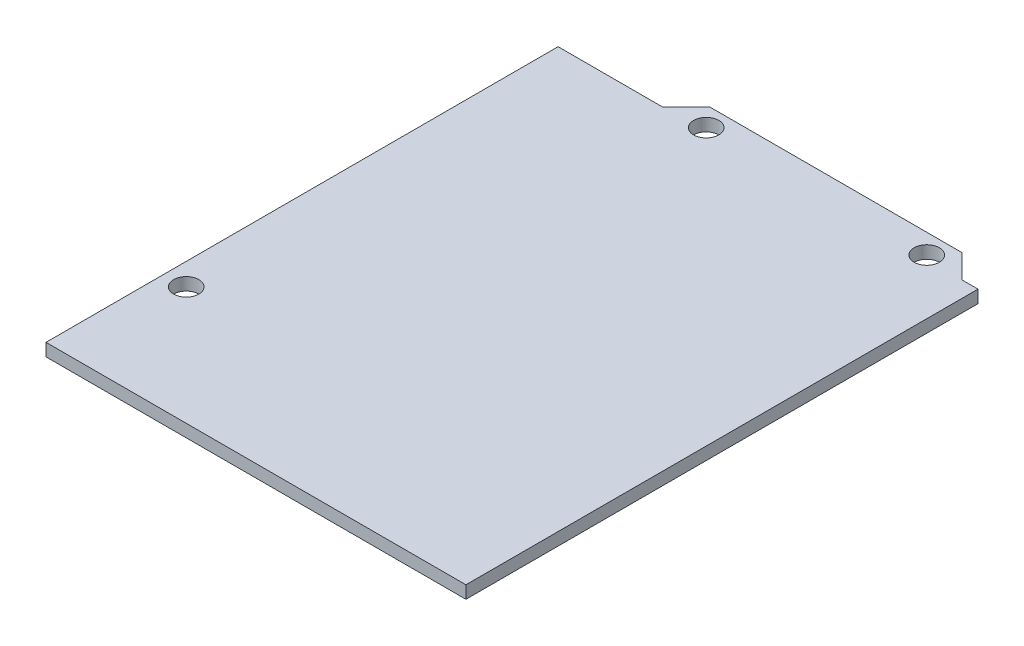
ISO-10303-21;
HEADER;
FILE_DESCRIPTION(('STEP AP214'),'2;1');
FILE_NAME('part.step','',(''),(''),'','','');
FILE_SCHEMA(('AUTOMOTIVE_DESIGN { 1 0 10303 214 1 1 1 1 }'));
ENDSEC;
DATA;
#1=APPLICATION_CONTEXT('core data for automotive mechanical design processes');
#2=APPLICATION_PROTOCOL_DEFINITION('international standard','automotive_design',2000,#1);
#3=PRODUCT_CONTEXT('',#1,'mechanical');
#4=PRODUCT('Part','Part','',(#3));
#5=PRODUCT_RELATED_PRODUCT_CATEGORY('part','',(#4));
#6=PRODUCT_DEFINITION_FORMATION('','',#4);
#7=PRODUCT_DEFINITION_CONTEXT('part definition',#1,'design');
#8=PRODUCT_DEFINITION('design','',#6,#7);
#9=PRODUCT_DEFINITION_SHAPE('','',#8);
#10=(LENGTH_UNIT() NAMED_UNIT(*) SI_UNIT(.MILLI.,.METRE.));
#11=(NAMED_UNIT(*) PLANE_ANGLE_UNIT() SI_UNIT($,.RADIAN.));
#12=(NAMED_UNIT(*) SI_UNIT($,.STERADIAN.) SOLID_ANGLE_UNIT());
#13=UNCERTAINTY_MEASURE_WITH_UNIT(LENGTH_MEASURE(1.E-05),#10,'distance_accuracy_value','');
#14=(GEOMETRIC_REPRESENTATION_CONTEXT(3) GLOBAL_UNCERTAINTY_ASSIGNED_CONTEXT((#13)) GLOBAL_UNIT_ASSIGNED_CONTEXT((#10,
#11,#12)) REPRESENTATION_CONTEXT('',''));
#15=CARTESIAN_POINT('',(0.,0.,0.));
#16=DIRECTION('',(0.,0.,1.));
#17=DIRECTION('',(1.,0.,0.));
#18=AXIS2_PLACEMENT_3D('',#15,#16,#17);
#19=CARTESIAN_POINT('',(0.,1.6,0.));
#20=DIRECTION('',(1.,0.,0.));
#21=DIRECTION('',(0.,0.,-1.));
#22=AXIS2_PLACEMENT_3D('',#19,#20,#21);
#23=PLANE('',#22);
#24=DIRECTION('',(0.,0.,1.));
#25=VECTOR('',#24,1.);
#26=CARTESIAN_POINT('',(0.,0.,0.));
#27=LINE('',#26,#25);
#28=CARTESIAN_POINT('',(0.,0.,-65.));
#29=VERTEX_POINT('',#28);
#30=CARTESIAN_POINT('',(0.,0.,0.));
#31=VERTEX_POINT('',#30);
#32=EDGE_CURVE('E129',#29,#31,#27,.T.);
#33=ORIENTED_EDGE('',*,*,#32,.T.);
#34=DIRECTION('',(0.,-1.,0.));
#35=VECTOR('',#34,1.);
#36=CARTESIAN_POINT('',(0.,1.6,0.));
#37=LINE('',#36,#35);
#38=CARTESIAN_POINT('',(0.,1.6,0.));
#39=VERTEX_POINT('',#38);
#40=EDGE_CURVE('E11',#39,#31,#37,.T.);
#41=ORIENTED_EDGE('',*,*,#40,.F.);
#42=DIRECTION('',(0.,0.,1.));
#43=VECTOR('',#42,1.);
#44=CARTESIAN_POINT('',(0.,1.6,0.));
#45=LINE('',#44,#43);
#46=CARTESIAN_POINT('',(0.,1.6,-65.));
#47=VERTEX_POINT('',#46);
#48=EDGE_CURVE('E144',#47,#39,#45,.T.);
#49=ORIENTED_EDGE('',*,*,#48,.F.);
#50=DIRECTION('',(0.,-1.,0.));
#51=VECTOR('',#50,1.);
#52=CARTESIAN_POINT('',(0.,1.6,-65.));
#53=LINE('',#52,#51);
#54=EDGE_CURVE('E125',#47,#29,#53,.T.);
#55=ORIENTED_EDGE('',*,*,#54,.T.);
#56=EDGE_LOOP('',(#33,#41,#49,#55));
#57=FACE_BOUND('',#56,.T.);
#58=ADVANCED_FACE('F33',(#57),#23,.F.);
#59=CARTESIAN_POINT('',(0.,1.6,0.));
#60=DIRECTION('',(0.,0.,-1.));
#61=DIRECTION('',(-1.,0.,0.));
#62=AXIS2_PLACEMENT_3D('',#59,#60,#61);
#63=PLANE('',#62);
#64=DIRECTION('',(1.,0.,0.));
#65=VECTOR('',#64,1.);
#66=CARTESIAN_POINT('',(0.,0.,0.));
#67=LINE('',#66,#65);
#68=CARTESIAN_POINT('',(53.3,0.,0.));
#69=VERTEX_POINT('',#68);
#70=EDGE_CURVE('E132',#31,#69,#67,.T.);
#71=ORIENTED_EDGE('',*,*,#70,.T.);
#72=DIRECTION('',(0.,-1.,0.));
#73=VECTOR('',#72,1.);
#74=CARTESIAN_POINT('',(53.3,1.6,0.));
#75=LINE('',#74,#73);
#76=CARTESIAN_POINT('',(53.3,1.6,0.));
#77=VERTEX_POINT('',#76);
#78=EDGE_CURVE('E41',#77,#69,#75,.T.);
#79=ORIENTED_EDGE('',*,*,#78,.F.);
#80=DIRECTION('',(1.,0.,0.));
#81=VECTOR('',#80,1.);
#82=CARTESIAN_POINT('',(0.,1.6,0.));
#83=LINE('',#82,#81);
#84=EDGE_CURVE('E92',#39,#77,#83,.T.);
#85=ORIENTED_EDGE('',*,*,#84,.F.);
#86=ORIENTED_EDGE('',*,*,#40,.T.);
#87=EDGE_LOOP('',(#71,#79,#85,#86));
#88=FACE_BOUND('',#87,.T.);
#89=ADVANCED_FACE('F223',(#88),#63,.F.);
#90=CARTESIAN_POINT('',(53.3,1.6,0.));
#91=DIRECTION('',(-1.,0.,0.));
#92=DIRECTION('',(0.,0.,1.));
#93=AXIS2_PLACEMENT_3D('',#90,#91,#92);
#94=PLANE('',#93);
#95=DIRECTION('',(0.,0.,-1.));
#96=VECTOR('',#95,1.);
#97=CARTESIAN_POINT('',(53.3,0.,0.));
#98=LINE('',#97,#96);
#99=CARTESIAN_POINT('',(53.3,0.,-65.));
#100=VERTEX_POINT('',#99);
#101=EDGE_CURVE('E135',#69,#100,#98,.T.);
#102=ORIENTED_EDGE('',*,*,#101,.T.);
#103=DIRECTION('',(0.,-1.,0.));
#104=VECTOR('',#103,1.);
#105=CARTESIAN_POINT('',(53.3,1.6,-65.));
#106=LINE('',#105,#104);
#107=CARTESIAN_POINT('',(53.3,1.6,-65.));
#108=VERTEX_POINT('',#107);
#109=EDGE_CURVE('E151',#108,#100,#106,.T.);
#110=ORIENTED_EDGE('',*,*,#109,.F.);
#111=DIRECTION('',(0.,0.,-1.));
#112=VECTOR('',#111,1.);
#113=CARTESIAN_POINT('',(53.3,1.6,0.));
#114=LINE('',#113,#112);
#115=EDGE_CURVE('E159',#77,#108,#114,.T.);
#116=ORIENTED_EDGE('',*,*,#115,.F.);
#117=ORIENTED_EDGE('',*,*,#78,.T.);
#118=EDGE_LOOP('',(#102,#110,#116,#117));
#119=FACE_BOUND('',#118,.T.);
#120=ADVANCED_FACE('F157',(#119),#94,.F.);
#121=CARTESIAN_POINT('',(53.3,1.6,-65.));
#122=DIRECTION('',(0.,0.,1.));
#123=DIRECTION('',(1.,0.,0.));
#124=AXIS2_PLACEMENT_3D('',#121,#122,#123);
#125=PLANE('',#124);
#126=DIRECTION('',(-1.,0.,0.));
#127=VECTOR('',#126,1.);
#128=CARTESIAN_POINT('',(53.3,0.,-65.));
#129=LINE('',#128,#127);
#130=CARTESIAN_POINT('',(51.3,0.,-65.));
#131=VERTEX_POINT('',#130);
#132=EDGE_CURVE('E137',#100,#131,#129,.T.);
#133=ORIENTED_EDGE('',*,*,#132,.T.);
#134=DIRECTION('',(0.,-1.,0.));
#135=VECTOR('',#134,1.);
#136=CARTESIAN_POINT('',(51.3,1.6,-65.));
#137=LINE('',#136,#135);
#138=CARTESIAN_POINT('',(51.3,1.6,-65.));
#139=VERTEX_POINT('',#138);
#140=EDGE_CURVE('E148',#139,#131,#137,.T.);
#141=ORIENTED_EDGE('',*,*,#140,.F.);
#142=DIRECTION('',(-1.,0.,0.));
#143=VECTOR('',#142,1.);
#144=CARTESIAN_POINT('',(53.3,1.6,-65.));
#145=LINE('',#144,#143);
#146=EDGE_CURVE('E171',#108,#139,#145,.T.);
#147=ORIENTED_EDGE('',*,*,#146,.F.);
#148=ORIENTED_EDGE('',*,*,#109,.T.);
#149=EDGE_LOOP('',(#133,#141,#147,#148));
#150=FACE_BOUND('',#149,.T.);
#151=ADVANCED_FACE('F167',(#150),#125,.F.);
#152=CARTESIAN_POINT('',(48.3,1.6,-68.));
#153=DIRECTION('',(-0.707106781186548,0.,0.707106781186547));
#154=DIRECTION('',(0.707106781186547,0.,0.707106781186548));
#155=AXIS2_PLACEMENT_3D('',#152,#153,#154);
#156=PLANE('',#155);
#157=DIRECTION('',(-0.707106781186547,0.,-0.707106781186548));
#158=VECTOR('',#157,1.);
#159=CARTESIAN_POINT('',(48.3,0.,-68.));
#160=LINE('',#159,#158);
#161=CARTESIAN_POINT('',(48.3,0.,-68.));
#162=VERTEX_POINT('',#161);
#163=EDGE_CURVE('E139',#131,#162,#160,.T.);
#164=ORIENTED_EDGE('',*,*,#163,.T.);
#165=DIRECTION('',(0.,-1.,0.));
#166=VECTOR('',#165,1.);
#167=CARTESIAN_POINT('',(48.3,1.6,-68.));
#168=LINE('',#167,#166);
#169=CARTESIAN_POINT('',(48.3,1.6,-68.));
#170=VERTEX_POINT('',#169);
#171=EDGE_CURVE('E120',#170,#162,#168,.T.);
#172=ORIENTED_EDGE('',*,*,#171,.F.);
#173=DIRECTION('',(-0.707106781186547,0.,-0.707106781186548));
#174=VECTOR('',#173,1.);
#175=CARTESIAN_POINT('',(48.3,1.6,-68.));
#176=LINE('',#175,#174);
#177=EDGE_CURVE('E111',#139,#170,#176,.T.);
#178=ORIENTED_EDGE('',*,*,#177,.F.);
#179=ORIENTED_EDGE('',*,*,#140,.T.);
#180=EDGE_LOOP('',(#164,#172,#178,#179));
#181=FACE_BOUND('',#180,.T.);
#182=ADVANCED_FACE('F170',(#181),#156,.F.);
#183=CARTESIAN_POINT('',(16.3,1.6,-68.));
#184=DIRECTION('',(0.,0.,1.));
#185=DIRECTION('',(1.,0.,0.));
#186=AXIS2_PLACEMENT_3D('',#183,#184,#185);
#187=PLANE('',#186);
#188=DIRECTION('',(-1.,0.,0.));
#189=VECTOR('',#188,1.);
#190=CARTESIAN_POINT('',(16.3,0.,-68.));
#191=LINE('',#190,#189);
#192=CARTESIAN_POINT('',(16.3,0.,-68.));
#193=VERTEX_POINT('',#192);
#194=EDGE_CURVE('E119',#162,#193,#191,.T.);
#195=ORIENTED_EDGE('',*,*,#194,.T.);
#196=DIRECTION('',(0.,-1.,0.));
#197=VECTOR('',#196,1.);
#198=CARTESIAN_POINT('',(16.3,1.6,-68.));
#199=LINE('',#198,#197);
#200=CARTESIAN_POINT('',(16.3,1.6,-68.));
#201=VERTEX_POINT('',#200);
#202=EDGE_CURVE('E116',#201,#193,#199,.T.);
#203=ORIENTED_EDGE('',*,*,#202,.F.);
#204=DIRECTION('',(-1.,0.,0.));
#205=VECTOR('',#204,1.);
#206=CARTESIAN_POINT('',(16.3,1.6,-68.));
#207=LINE('',#206,#205);
#208=EDGE_CURVE('E105',#170,#201,#207,.T.);
#209=ORIENTED_EDGE('',*,*,#208,.F.);
#210=ORIENTED_EDGE('',*,*,#171,.T.);
#211=EDGE_LOOP('',(#195,#203,#209,#210));
#212=FACE_BOUND('',#211,.T.);
#213=ADVANCED_FACE('F117',(#212),#187,.F.);
#214=CARTESIAN_POINT('',(13.3,1.6,-65.));
#215=DIRECTION('',(0.707106781186548,0.,0.707106781186547));
#216=DIRECTION('',(0.707106781186547,0.,-0.707106781186548));
#217=AXIS2_PLACEMENT_3D('',#214,#215,#216);
#218=PLANE('',#217);
#219=DIRECTION('',(-0.707106781186547,0.,0.707106781186548));
#220=VECTOR('',#219,1.);
#221=CARTESIAN_POINT('',(13.3,0.,-65.));
#222=LINE('',#221,#220);
#223=CARTESIAN_POINT('',(13.3,0.,-65.));
#224=VERTEX_POINT('',#223);
#225=EDGE_CURVE('E78',#193,#224,#222,.T.);
#226=ORIENTED_EDGE('',*,*,#225,.T.);
#227=DIRECTION('',(0.,-1.,0.));
#228=VECTOR('',#227,1.);
#229=CARTESIAN_POINT('',(13.3,1.6,-65.));
#230=LINE('',#229,#228);
#231=CARTESIAN_POINT('',(13.3,1.6,-65.));
#232=VERTEX_POINT('',#231);
#233=EDGE_CURVE('E121',#232,#224,#230,.T.);
#234=ORIENTED_EDGE('',*,*,#233,.F.);
#235=DIRECTION('',(-0.707106781186547,0.,0.707106781186548));
#236=VECTOR('',#235,1.);
#237=CARTESIAN_POINT('',(13.3,1.6,-65.));
#238=LINE('',#237,#236);
#239=EDGE_CURVE('E109',#201,#232,#238,.T.);
#240=ORIENTED_EDGE('',*,*,#239,.F.);
#241=ORIENTED_EDGE('',*,*,#202,.T.);
#242=EDGE_LOOP('',(#226,#234,#240,#241));
#243=FACE_BOUND('',#242,.T.);
#244=ADVANCED_FACE('F123',(#243),#218,.F.);
#245=CARTESIAN_POINT('',(0.,1.6,-65.));
#246=DIRECTION('',(0.,0.,1.));
#247=DIRECTION('',(1.,0.,0.));
#248=AXIS2_PLACEMENT_3D('',#245,#246,#247);
#249=PLANE('',#248);
#250=DIRECTION('',(-1.,0.,0.));
#251=VECTOR('',#250,1.);
#252=CARTESIAN_POINT('',(0.,0.,-65.));
#253=LINE('',#252,#251);
#254=EDGE_CURVE('E84',#224,#29,#253,.T.);
#255=ORIENTED_EDGE('',*,*,#254,.T.);
#256=ORIENTED_EDGE('',*,*,#54,.F.);
#257=DIRECTION('',(-1.,0.,0.));
#258=VECTOR('',#257,1.);
#259=CARTESIAN_POINT('',(0.,1.6,-65.));
#260=LINE('',#259,#258);
#261=EDGE_CURVE('E49',#232,#47,#260,.T.);
#262=ORIENTED_EDGE('',*,*,#261,.F.);
#263=ORIENTED_EDGE('',*,*,#233,.T.);
#264=EDGE_LOOP('',(#255,#256,#262,#263));
#265=FACE_BOUND('',#264,.T.);
#266=ADVANCED_FACE('F207',(#265),#249,.F.);
#267=CARTESIAN_POINT('',(0.,1.6,0.));
#268=DIRECTION('',(0.,-1.,0.));
#269=DIRECTION('',(0.,0.,-1.));
#270=AXIS2_PLACEMENT_3D('',#267,#268,#269);
#271=PLANE('',#270);
#272=CARTESIAN_POINT('',(2.79999999999999,1.6,-15.));
#273=DIRECTION('',(0.,1.,0.));
#274=DIRECTION('',(0.,0.,1.));
#275=AXIS2_PLACEMENT_3D('',#272,#273,#274);
#276=CIRCLE('',#275,1.6);
#277=CARTESIAN_POINT('',(2.79999999999999,1.6,-13.4));
#278=VERTEX_POINT('',#277);
#279=EDGE_CURVE('E183',#278,#278,#276,.T.);
#280=ORIENTED_EDGE('',*,*,#279,.F.);
#281=EDGE_LOOP('',(#280));
#282=FACE_BOUND('',#281,.T.);
#283=CARTESIAN_POINT('',(46.3,1.6,-65.5));
#284=DIRECTION('',(0.,1.,0.));
#285=DIRECTION('',(0.,0.,1.));
#286=AXIS2_PLACEMENT_3D('',#283,#284,#285);
#287=CIRCLE('',#286,1.6);
#288=CARTESIAN_POINT('',(46.3,1.6,-63.9));
#289=VERTEX_POINT('',#288);
#290=EDGE_CURVE('E189',#289,#289,#287,.T.);
#291=ORIENTED_EDGE('',*,*,#290,.F.);
#292=EDGE_LOOP('',(#291));
#293=FACE_BOUND('',#292,.T.);
#294=CARTESIAN_POINT('',(18.3,1.6,-65.5));
#295=DIRECTION('',(0.,1.,0.));
#296=DIRECTION('',(0.,0.,1.));
#297=AXIS2_PLACEMENT_3D('',#294,#295,#296);
#298=CIRCLE('',#297,1.6);
#299=CARTESIAN_POINT('',(18.3,1.6,-63.9));
#300=VERTEX_POINT('',#299);
#301=EDGE_CURVE('E177',#300,#300,#298,.T.);
#302=ORIENTED_EDGE('',*,*,#301,.F.);
#303=EDGE_LOOP('',(#302));
#304=FACE_BOUND('',#303,.T.);
#305=ORIENTED_EDGE('',*,*,#48,.T.);
#306=ORIENTED_EDGE('',*,*,#84,.T.);
#307=ORIENTED_EDGE('',*,*,#115,.T.);
#308=ORIENTED_EDGE('',*,*,#146,.T.);
#309=ORIENTED_EDGE('',*,*,#177,.T.);
#310=ORIENTED_EDGE('',*,*,#208,.T.);
#311=ORIENTED_EDGE('',*,*,#239,.T.);
#312=ORIENTED_EDGE('',*,*,#261,.T.);
#313=EDGE_LOOP('',(#305,#306,#307,#308,#309,#310,#311,#312));
#314=FACE_BOUND('',#313,.T.);
#315=ADVANCED_FACE('F107',(#282,#293,#304,#314),#271,.F.);
#316=CARTESIAN_POINT('',(0.,0.,0.));
#317=DIRECTION('',(0.,-1.,0.));
#318=DIRECTION('',(0.,0.,-1.));
#319=AXIS2_PLACEMENT_3D('',#316,#317,#318);
#320=PLANE('',#319);
#321=CARTESIAN_POINT('',(2.79999999999999,0.,-15.));
#322=DIRECTION('',(0.,1.,0.));
#323=DIRECTION('',(0.,0.,1.));
#324=AXIS2_PLACEMENT_3D('',#321,#322,#323);
#325=CIRCLE('',#324,1.6);
#326=CARTESIAN_POINT('',(2.79999999999999,0.,-13.4));
#327=VERTEX_POINT('',#326);
#328=EDGE_CURVE('E186',#327,#327,#325,.T.);
#329=ORIENTED_EDGE('',*,*,#328,.T.);
#330=EDGE_LOOP('',(#329));
#331=FACE_BOUND('',#330,.T.);
#332=CARTESIAN_POINT('',(46.3,0.,-65.5));
#333=DIRECTION('',(0.,1.,0.));
#334=DIRECTION('',(0.,0.,1.));
#335=AXIS2_PLACEMENT_3D('',#332,#333,#334);
#336=CIRCLE('',#335,1.6);
#337=CARTESIAN_POINT('',(46.3,0.,-63.9));
#338=VERTEX_POINT('',#337);
#339=EDGE_CURVE('E180',#338,#338,#336,.T.);
#340=ORIENTED_EDGE('',*,*,#339,.T.);
#341=EDGE_LOOP('',(#340));
#342=FACE_BOUND('',#341,.T.);
#343=CARTESIAN_POINT('',(18.3,0.,-65.5));
#344=DIRECTION('',(0.,1.,0.));
#345=DIRECTION('',(0.,0.,1.));
#346=AXIS2_PLACEMENT_3D('',#343,#344,#345);
#347=CIRCLE('',#346,1.6);
#348=CARTESIAN_POINT('',(18.3,0.,-63.9));
#349=VERTEX_POINT('',#348);
#350=EDGE_CURVE('E133',#349,#349,#347,.T.);
#351=ORIENTED_EDGE('',*,*,#350,.T.);
#352=EDGE_LOOP('',(#351));
#353=FACE_BOUND('',#352,.T.);
#354=ORIENTED_EDGE('',*,*,#32,.F.);
#355=ORIENTED_EDGE('',*,*,#254,.F.);
#356=ORIENTED_EDGE('',*,*,#225,.F.);
#357=ORIENTED_EDGE('',*,*,#194,.F.);
#358=ORIENTED_EDGE('',*,*,#163,.F.);
#359=ORIENTED_EDGE('',*,*,#132,.F.);
#360=ORIENTED_EDGE('',*,*,#101,.F.);
#361=ORIENTED_EDGE('',*,*,#70,.F.);
#362=EDGE_LOOP('',(#354,#355,#356,#357,#358,#359,#360,#361));
#363=FACE_BOUND('',#362,.T.);
#364=ADVANCED_FACE('F163',(#331,#342,#353,#363),#320,.T.);
#365=CARTESIAN_POINT('',(18.3,0.,-65.5));
#366=DIRECTION('',(0.,1.,0.));
#367=DIRECTION('',(0.,0.,1.));
#368=AXIS2_PLACEMENT_3D('',#365,#366,#367);
#369=CYLINDRICAL_SURFACE('',#368,1.6);
#370=ORIENTED_EDGE('',*,*,#350,.F.);
#371=EDGE_LOOP('',(#370));
#372=FACE_BOUND('',#371,.T.);
#373=ORIENTED_EDGE('',*,*,#301,.T.);
#374=EDGE_LOOP('',(#373));
#375=FACE_BOUND('',#374,.T.);
#376=ADVANCED_FACE('F201',(#372,#375),#369,.F.);
#377=CARTESIAN_POINT('',(46.3,0.,-65.5));
#378=DIRECTION('',(0.,1.,0.));
#379=DIRECTION('',(0.,0.,1.));
#380=AXIS2_PLACEMENT_3D('',#377,#378,#379);
#381=CYLINDRICAL_SURFACE('',#380,1.6);
#382=ORIENTED_EDGE('',*,*,#339,.F.);
#383=EDGE_LOOP('',(#382));
#384=FACE_BOUND('',#383,.T.);
#385=ORIENTED_EDGE('',*,*,#290,.T.);
#386=EDGE_LOOP('',(#385));
#387=FACE_BOUND('',#386,.T.);
#388=ADVANCED_FACE('F197',(#384,#387),#381,.F.);
#389=CARTESIAN_POINT('',(2.79999999999999,0.,-15.));
#390=DIRECTION('',(0.,1.,0.));
#391=DIRECTION('',(0.,0.,1.));
#392=AXIS2_PLACEMENT_3D('',#389,#390,#391);
#393=CYLINDRICAL_SURFACE('',#392,1.6);
#394=ORIENTED_EDGE('',*,*,#328,.F.);
#395=EDGE_LOOP('',(#394));
#396=FACE_BOUND('',#395,.T.);
#397=ORIENTED_EDGE('',*,*,#279,.T.);
#398=EDGE_LOOP('',(#397));
#399=FACE_BOUND('',#398,.T.);
#400=ADVANCED_FACE('F200',(#396,#399),#393,.F.);
#401=CLOSED_SHELL('',(#58,#89,#120,#151,#182,#213,#244,#266,#315,#364,#376,#388,#400));
#402=MANIFOLD_SOLID_BREP('B2',#401);
#403=ADVANCED_BREP_SHAPE_REPRESENTATION('',(#18,#402),#14);
#404=SHAPE_DEFINITION_REPRESENTATION(#9,#403);
ENDSEC;
END-ISO-10303-21;
